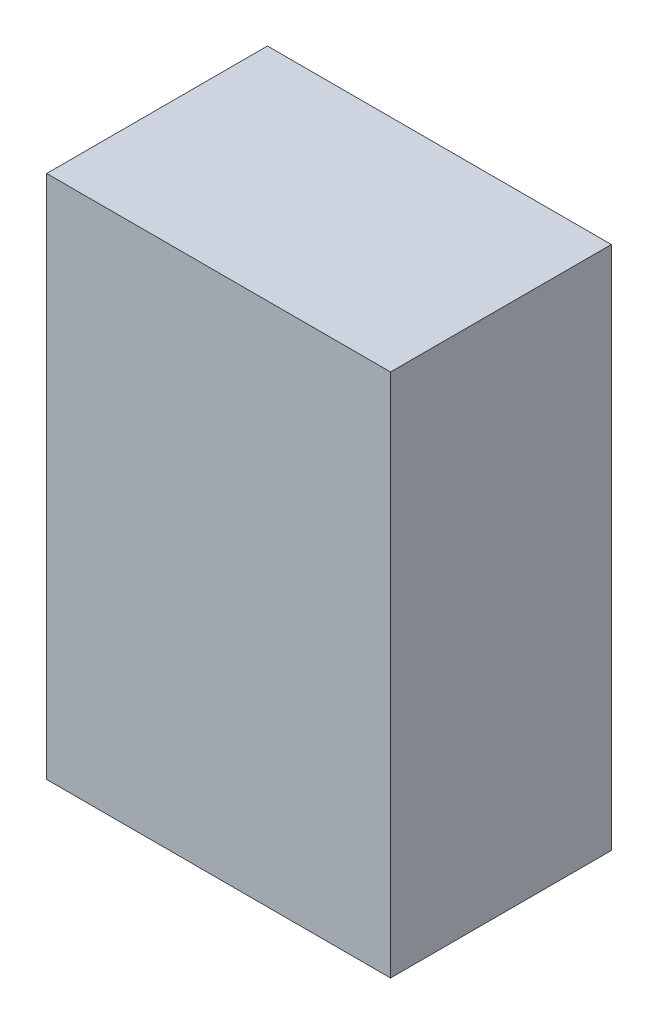
ISO-10303-21;
HEADER;
FILE_DESCRIPTION(('STEP AP214'),'2;1');
FILE_NAME('part.step','',(''),(''),'','','');
FILE_SCHEMA(('AUTOMOTIVE_DESIGN { 1 0 10303 214 1 1 1 1 }'));
ENDSEC;
DATA;
#1=APPLICATION_CONTEXT('core data for automotive mechanical design processes');
#2=APPLICATION_PROTOCOL_DEFINITION('international standard','automotive_design',2000,#1);
#3=PRODUCT_CONTEXT('',#1,'mechanical');
#4=PRODUCT('Part','Part','',(#3));
#5=PRODUCT_RELATED_PRODUCT_CATEGORY('part','',(#4));
#6=PRODUCT_DEFINITION_FORMATION('','',#4);
#7=PRODUCT_DEFINITION_CONTEXT('part definition',#1,'design');
#8=PRODUCT_DEFINITION('design','',#6,#7);
#9=PRODUCT_DEFINITION_SHAPE('','',#8);
#10=(LENGTH_UNIT() NAMED_UNIT(*) SI_UNIT(.MILLI.,.METRE.));
#11=(NAMED_UNIT(*) PLANE_ANGLE_UNIT() SI_UNIT($,.RADIAN.));
#12=(NAMED_UNIT(*) SI_UNIT($,.STERADIAN.) SOLID_ANGLE_UNIT());
#13=UNCERTAINTY_MEASURE_WITH_UNIT(LENGTH_MEASURE(1.E-05),#10,'distance_accuracy_value','');
#14=(GEOMETRIC_REPRESENTATION_CONTEXT(3) GLOBAL_UNCERTAINTY_ASSIGNED_CONTEXT((#13)) GLOBAL_UNIT_ASSIGNED_CONTEXT((#10,
#11,#12)) REPRESENTATION_CONTEXT('',''));
#15=CARTESIAN_POINT('',(0.,0.,0.));
#16=DIRECTION('',(0.,0.,1.));
#17=DIRECTION('',(1.,0.,0.));
#18=AXIS2_PLACEMENT_3D('',#15,#16,#17);
#19=CARTESIAN_POINT('',(0.95000064,-1.44999964,1.2200001));
#20=DIRECTION('',(0.,0.,-1.));
#21=DIRECTION('',(-1.,0.,0.));
#22=AXIS2_PLACEMENT_3D('',#19,#20,#21);
#23=PLANE('',#22);
#24=DIRECTION('',(1.,0.,0.));
#25=VECTOR('',#24,1.);
#26=CARTESIAN_POINT('',(0.95000064,1.44999964,1.2200001));
#27=LINE('',#26,#25);
#28=CARTESIAN_POINT('',(0.95000064,1.44999964,1.2200001));
#29=VERTEX_POINT('',#28);
#30=CARTESIAN_POINT('',(-0.95000064,1.44999964,1.2200001));
#31=VERTEX_POINT('',#30);
#32=EDGE_CURVE('E55',#29,#31,#27,.F.);
#33=ORIENTED_EDGE('',*,*,#32,.T.);
#34=DIRECTION('',(0.,1.,0.));
#35=VECTOR('',#34,1.);
#36=CARTESIAN_POINT('',(-0.95000064,1.44999964,1.2200001));
#37=LINE('',#36,#35);
#38=CARTESIAN_POINT('',(-0.95000064,-1.44999964,1.2200001));
#39=VERTEX_POINT('',#38);
#40=EDGE_CURVE('E57',#31,#39,#37,.F.);
#41=ORIENTED_EDGE('',*,*,#40,.T.);
#42=DIRECTION('',(1.,0.,0.));
#43=VECTOR('',#42,1.);
#44=CARTESIAN_POINT('',(-0.95000064,-1.44999964,1.2200001));
#45=LINE('',#44,#43);
#46=CARTESIAN_POINT('',(0.95000064,-1.44999964,1.2200001));
#47=VERTEX_POINT('',#46);
#48=EDGE_CURVE('E20',#39,#47,#45,.T.);
#49=ORIENTED_EDGE('',*,*,#48,.T.);
#50=DIRECTION('',(0.,1.,0.));
#51=VECTOR('',#50,1.);
#52=CARTESIAN_POINT('',(0.95000064,-1.44999964,1.2200001));
#53=LINE('',#52,#51);
#54=EDGE_CURVE('E80',#47,#29,#53,.T.);
#55=ORIENTED_EDGE('',*,*,#54,.T.);
#56=EDGE_LOOP('',(#33,#41,#49,#55));
#57=FACE_BOUND('',#56,.T.);
#58=ADVANCED_FACE('F17',(#57),#23,.F.);
#59=CARTESIAN_POINT('',(-0.95000064,-1.44999964,0.));
#60=DIRECTION('',(0.,1.,0.));
#61=DIRECTION('',(0.,0.,1.));
#62=AXIS2_PLACEMENT_3D('',#59,#60,#61);
#63=PLANE('',#62);
#64=DIRECTION('',(0.,0.,1.));
#65=VECTOR('',#64,1.);
#66=CARTESIAN_POINT('',(0.95000064,-1.44999964,0.));
#67=LINE('',#66,#65);
#68=CARTESIAN_POINT('',(0.95000064,-1.44999964,0.));
#69=VERTEX_POINT('',#68);
#70=EDGE_CURVE('E68',#69,#47,#67,.T.);
#71=ORIENTED_EDGE('',*,*,#70,.T.);
#72=ORIENTED_EDGE('',*,*,#48,.F.);
#73=DIRECTION('',(0.,0.,-1.));
#74=VECTOR('',#73,1.);
#75=CARTESIAN_POINT('',(-0.95000064,-1.44999964,0.));
#76=LINE('',#75,#74);
#77=CARTESIAN_POINT('',(-0.95000064,-1.44999964,0.));
#78=VERTEX_POINT('',#77);
#79=EDGE_CURVE('E63',#39,#78,#76,.T.);
#80=ORIENTED_EDGE('',*,*,#79,.T.);
#81=DIRECTION('',(-1.,0.,0.));
#82=VECTOR('',#81,1.);
#83=CARTESIAN_POINT('',(0.95000064,-1.44999964,0.));
#84=LINE('',#83,#82);
#85=EDGE_CURVE('E83',#69,#78,#84,.T.);
#86=ORIENTED_EDGE('',*,*,#85,.F.);
#87=EDGE_LOOP('',(#71,#72,#80,#86));
#88=FACE_BOUND('',#87,.T.);
#89=ADVANCED_FACE('F65',(#88),#63,.F.);
#90=CARTESIAN_POINT('',(-0.95000064,1.44999964,0.));
#91=DIRECTION('',(1.,0.,0.));
#92=DIRECTION('',(0.,0.,-1.));
#93=AXIS2_PLACEMENT_3D('',#90,#91,#92);
#94=PLANE('',#93);
#95=ORIENTED_EDGE('',*,*,#79,.F.);
#96=ORIENTED_EDGE('',*,*,#40,.F.);
#97=DIRECTION('',(0.,0.,-1.));
#98=VECTOR('',#97,1.);
#99=CARTESIAN_POINT('',(-0.95000064,1.44999964,0.));
#100=LINE('',#99,#98);
#101=CARTESIAN_POINT('',(-0.95000064,1.44999964,0.));
#102=VERTEX_POINT('',#101);
#103=EDGE_CURVE('E75',#31,#102,#100,.T.);
#104=ORIENTED_EDGE('',*,*,#103,.T.);
#105=DIRECTION('',(0.,1.,0.));
#106=VECTOR('',#105,1.);
#107=CARTESIAN_POINT('',(-0.95000064,-1.44999964,0.));
#108=LINE('',#107,#106);
#109=EDGE_CURVE('E72',#78,#102,#108,.T.);
#110=ORIENTED_EDGE('',*,*,#109,.F.);
#111=EDGE_LOOP('',(#95,#96,#104,#110));
#112=FACE_BOUND('',#111,.T.);
#113=ADVANCED_FACE('F70',(#112),#94,.F.);
#114=CARTESIAN_POINT('',(0.95000064,1.44999964,0.));
#115=DIRECTION('',(0.,-1.,0.));
#116=DIRECTION('',(0.,0.,-1.));
#117=AXIS2_PLACEMENT_3D('',#114,#115,#116);
#118=PLANE('',#117);
#119=ORIENTED_EDGE('',*,*,#103,.F.);
#120=ORIENTED_EDGE('',*,*,#32,.F.);
#121=DIRECTION('',(0.,0.,1.));
#122=VECTOR('',#121,1.);
#123=CARTESIAN_POINT('',(0.95000064,1.44999964,0.));
#124=LINE('',#123,#122);
#125=CARTESIAN_POINT('',(0.95000064,1.44999964,0.));
#126=VERTEX_POINT('',#125);
#127=EDGE_CURVE('E35',#29,#126,#124,.F.);
#128=ORIENTED_EDGE('',*,*,#127,.T.);
#129=DIRECTION('',(-1.,0.,0.));
#130=VECTOR('',#129,1.);
#131=CARTESIAN_POINT('',(0.95000064,1.44999964,0.));
#132=LINE('',#131,#130);
#133=EDGE_CURVE('E26',#102,#126,#132,.F.);
#134=ORIENTED_EDGE('',*,*,#133,.F.);
#135=EDGE_LOOP('',(#119,#120,#128,#134));
#136=FACE_BOUND('',#135,.T.);
#137=ADVANCED_FACE('F89',(#136),#118,.F.);
#138=CARTESIAN_POINT('',(0.95000064,-1.44999964,0.));
#139=DIRECTION('',(-1.,0.,0.));
#140=DIRECTION('',(0.,0.,1.));
#141=AXIS2_PLACEMENT_3D('',#138,#139,#140);
#142=PLANE('',#141);
#143=ORIENTED_EDGE('',*,*,#127,.F.);
#144=ORIENTED_EDGE('',*,*,#54,.F.);
#145=ORIENTED_EDGE('',*,*,#70,.F.);
#146=DIRECTION('',(0.,1.,0.));
#147=VECTOR('',#146,1.);
#148=CARTESIAN_POINT('',(0.95000064,-1.44999964,0.));
#149=LINE('',#148,#147);
#150=EDGE_CURVE('E11',#126,#69,#149,.F.);
#151=ORIENTED_EDGE('',*,*,#150,.F.);
#152=EDGE_LOOP('',(#143,#144,#145,#151));
#153=FACE_BOUND('',#152,.T.);
#154=ADVANCED_FACE('F91',(#153),#142,.F.);
#155=CARTESIAN_POINT('',(0.95000064,-1.44999964,0.));
#156=DIRECTION('',(0.,0.,-1.));
#157=DIRECTION('',(-1.,0.,0.));
#158=AXIS2_PLACEMENT_3D('',#155,#156,#157);
#159=PLANE('',#158);
#160=ORIENTED_EDGE('',*,*,#133,.T.);
#161=ORIENTED_EDGE('',*,*,#150,.T.);
#162=ORIENTED_EDGE('',*,*,#85,.T.);
#163=ORIENTED_EDGE('',*,*,#109,.T.);
#164=EDGE_LOOP('',(#160,#161,#162,#163));
#165=FACE_BOUND('',#164,.T.);
#166=ADVANCED_FACE('F88',(#165),#159,.T.);
#167=CLOSED_SHELL('',(#58,#89,#113,#137,#154,#166));
#168=MANIFOLD_SOLID_BREP('B1',#167);
#169=ADVANCED_BREP_SHAPE_REPRESENTATION('',(#18,#168),#14);
#170=SHAPE_DEFINITION_REPRESENTATION(#9,#169);
ENDSEC;
END-ISO-10303-21;
